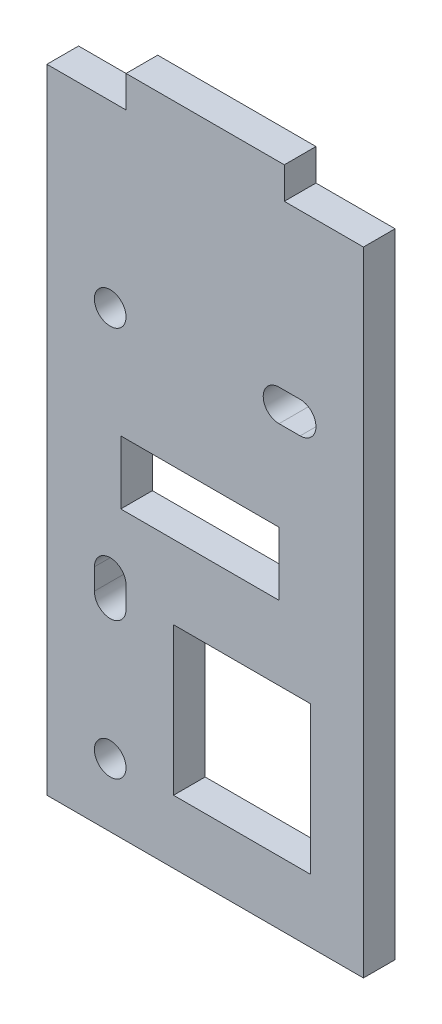
ISO-10303-21;
HEADER;
FILE_DESCRIPTION(('STEP AP214'),'2;1');
FILE_NAME('part.step','',(''),(''),'','','');
FILE_SCHEMA(('AUTOMOTIVE_DESIGN { 1 0 10303 214 1 1 1 1 }'));
ENDSEC;
DATA;
#1=APPLICATION_CONTEXT('core data for automotive mechanical design processes');
#2=APPLICATION_PROTOCOL_DEFINITION('international standard','automotive_design',2000,#1);
#3=PRODUCT_CONTEXT('',#1,'mechanical');
#4=PRODUCT('Part','Part','',(#3));
#5=PRODUCT_RELATED_PRODUCT_CATEGORY('part','',(#4));
#6=PRODUCT_DEFINITION_FORMATION('','',#4);
#7=PRODUCT_DEFINITION_CONTEXT('part definition',#1,'design');
#8=PRODUCT_DEFINITION('design','',#6,#7);
#9=PRODUCT_DEFINITION_SHAPE('','',#8);
#10=(LENGTH_UNIT() NAMED_UNIT(*) SI_UNIT(.MILLI.,.METRE.));
#11=(NAMED_UNIT(*) PLANE_ANGLE_UNIT() SI_UNIT($,.RADIAN.));
#12=(NAMED_UNIT(*) SI_UNIT($,.STERADIAN.) SOLID_ANGLE_UNIT());
#13=UNCERTAINTY_MEASURE_WITH_UNIT(LENGTH_MEASURE(1.E-05),#10,'distance_accuracy_value','');
#14=(GEOMETRIC_REPRESENTATION_CONTEXT(3) GLOBAL_UNCERTAINTY_ASSIGNED_CONTEXT((#13)) GLOBAL_UNIT_ASSIGNED_CONTEXT((#10,
#11,#12)) REPRESENTATION_CONTEXT('',''));
#15=CARTESIAN_POINT('',(0.,0.,0.));
#16=DIRECTION('',(0.,0.,1.));
#17=DIRECTION('',(1.,0.,0.));
#18=AXIS2_PLACEMENT_3D('',#15,#16,#17);
#19=CARTESIAN_POINT('',(0.,0.,3.));
#20=DIRECTION('',(0.,0.,-1.));
#21=DIRECTION('',(-1.,0.,0.));
#22=AXIS2_PLACEMENT_3D('',#19,#20,#21);
#23=PLANE('',#22);
#24=CARTESIAN_POINT('',(6.,21.,3.));
#25=DIRECTION('',(0.,0.,1.));
#26=DIRECTION('',(1.,0.,0.));
#27=AXIS2_PLACEMENT_3D('',#24,#25,#26);
#28=CIRCLE('',#27,1.5);
#29=CARTESIAN_POINT('',(7.5,21.,3.));
#30=VERTEX_POINT('',#29);
#31=CARTESIAN_POINT('',(4.5,21.,3.));
#32=VERTEX_POINT('',#31);
#33=EDGE_CURVE('E255',#30,#32,#28,.T.);
#34=ORIENTED_EDGE('',*,*,#33,.F.);
#35=DIRECTION('',(0.,1.,0.));
#36=VECTOR('',#35,1.);
#37=CARTESIAN_POINT('',(7.5,21.,3.));
#38=LINE('',#37,#36);
#39=CARTESIAN_POINT('',(7.5,19.,3.));
#40=VERTEX_POINT('',#39);
#41=EDGE_CURVE('E266',#40,#30,#38,.T.);
#42=ORIENTED_EDGE('',*,*,#41,.F.);
#43=CARTESIAN_POINT('',(6.,19.,3.));
#44=DIRECTION('',(0.,0.,1.));
#45=DIRECTION('',(1.,0.,0.));
#46=AXIS2_PLACEMENT_3D('',#43,#44,#45);
#47=CIRCLE('',#46,1.5);
#48=CARTESIAN_POINT('',(4.5,19.,3.));
#49=VERTEX_POINT('',#48);
#50=EDGE_CURVE('E262',#49,#40,#47,.T.);
#51=ORIENTED_EDGE('',*,*,#50,.F.);
#52=DIRECTION('',(0.,-1.,0.));
#53=VECTOR('',#52,1.);
#54=CARTESIAN_POINT('',(4.5,21.,3.));
#55=LINE('',#54,#53);
#56=EDGE_CURVE('E258',#32,#49,#55,.T.);
#57=ORIENTED_EDGE('',*,*,#56,.F.);
#58=EDGE_LOOP('',(#34,#42,#51,#57));
#59=FACE_BOUND('',#58,.T.);
#60=CARTESIAN_POINT('',(6.,43.,3.));
#61=DIRECTION('',(0.,0.,1.));
#62=DIRECTION('',(1.,0.,0.));
#63=AXIS2_PLACEMENT_3D('',#60,#61,#62);
#64=CIRCLE('',#63,1.5);
#65=CARTESIAN_POINT('',(7.5,43.,3.));
#66=VERTEX_POINT('',#65);
#67=EDGE_CURVE('E341',#66,#66,#64,.T.);
#68=ORIENTED_EDGE('',*,*,#67,.F.);
#69=EDGE_LOOP('',(#68));
#70=FACE_BOUND('',#69,.T.);
#71=CARTESIAN_POINT('',(6.,6.,3.));
#72=DIRECTION('',(0.,0.,1.));
#73=DIRECTION('',(1.,0.,0.));
#74=AXIS2_PLACEMENT_3D('',#71,#72,#73);
#75=CIRCLE('',#74,1.5);
#76=CARTESIAN_POINT('',(7.5,6.,3.));
#77=VERTEX_POINT('',#76);
#78=EDGE_CURVE('E349',#77,#77,#75,.T.);
#79=ORIENTED_EDGE('',*,*,#78,.F.);
#80=EDGE_LOOP('',(#79));
#81=FACE_BOUND('',#80,.T.);
#82=DIRECTION('',(0.,-1.,0.));
#83=VECTOR('',#82,1.);
#84=CARTESIAN_POINT('',(12.,20.,3.));
#85=LINE('',#84,#83);
#86=CARTESIAN_POINT('',(12.,20.,3.));
#87=VERTEX_POINT('',#86);
#88=CARTESIAN_POINT('',(12.,6.,3.));
#89=VERTEX_POINT('',#88);
#90=EDGE_CURVE('E357',#87,#89,#85,.T.);
#91=ORIENTED_EDGE('',*,*,#90,.F.);
#92=DIRECTION('',(-1.,0.,0.));
#93=VECTOR('',#92,1.);
#94=CARTESIAN_POINT('',(12.,20.,3.));
#95=LINE('',#94,#93);
#96=CARTESIAN_POINT('',(25.,20.,3.));
#97=VERTEX_POINT('',#96);
#98=EDGE_CURVE('E368',#97,#87,#95,.T.);
#99=ORIENTED_EDGE('',*,*,#98,.F.);
#100=DIRECTION('',(0.,1.,0.));
#101=VECTOR('',#100,1.);
#102=CARTESIAN_POINT('',(25.,20.,3.));
#103=LINE('',#102,#101);
#104=CARTESIAN_POINT('',(25.,6.,3.));
#105=VERTEX_POINT('',#104);
#106=EDGE_CURVE('E364',#105,#97,#103,.T.);
#107=ORIENTED_EDGE('',*,*,#106,.F.);
#108=DIRECTION('',(1.,0.,0.));
#109=VECTOR('',#108,1.);
#110=CARTESIAN_POINT('',(12.,6.,3.));
#111=LINE('',#110,#109);
#112=EDGE_CURVE('E360',#89,#105,#111,.T.);
#113=ORIENTED_EDGE('',*,*,#112,.F.);
#114=EDGE_LOOP('',(#91,#99,#107,#113));
#115=FACE_BOUND('',#114,.T.);
#116=DIRECTION('',(0.,-1.,0.));
#117=VECTOR('',#116,1.);
#118=CARTESIAN_POINT('',(0.,0.,3.));
#119=LINE('',#118,#117);
#120=CARTESIAN_POINT('',(0.,60.,3.));
#121=VERTEX_POINT('',#120);
#122=CARTESIAN_POINT('',(0.,0.,3.));
#123=VERTEX_POINT('',#122);
#124=EDGE_CURVE('E400',#121,#123,#119,.T.);
#125=ORIENTED_EDGE('',*,*,#124,.T.);
#126=DIRECTION('',(1.,0.,0.));
#127=VECTOR('',#126,1.);
#128=CARTESIAN_POINT('',(0.,0.,3.));
#129=LINE('',#128,#127);
#130=CARTESIAN_POINT('',(30.,0.,3.));
#131=VERTEX_POINT('',#130);
#132=EDGE_CURVE('E404',#123,#131,#129,.T.);
#133=ORIENTED_EDGE('',*,*,#132,.T.);
#134=DIRECTION('',(0.,1.,0.));
#135=VECTOR('',#134,1.);
#136=CARTESIAN_POINT('',(30.,0.,3.));
#137=LINE('',#136,#135);
#138=CARTESIAN_POINT('',(30.,60.,3.));
#139=VERTEX_POINT('',#138);
#140=EDGE_CURVE('E408',#131,#139,#137,.T.);
#141=ORIENTED_EDGE('',*,*,#140,.T.);
#142=DIRECTION('',(-1.,0.,0.));
#143=VECTOR('',#142,1.);
#144=CARTESIAN_POINT('',(22.5,60.,3.));
#145=LINE('',#144,#143);
#146=CARTESIAN_POINT('',(22.5,60.,3.));
#147=VERTEX_POINT('',#146);
#148=EDGE_CURVE('E411',#139,#147,#145,.T.);
#149=ORIENTED_EDGE('',*,*,#148,.T.);
#150=DIRECTION('',(0.,1.,0.));
#151=VECTOR('',#150,1.);
#152=CARTESIAN_POINT('',(22.5,60.,3.));
#153=LINE('',#152,#151);
#154=CARTESIAN_POINT('',(22.5,63.,3.));
#155=VERTEX_POINT('',#154);
#156=EDGE_CURVE('E414',#147,#155,#153,.T.);
#157=ORIENTED_EDGE('',*,*,#156,.T.);
#158=DIRECTION('',(-1.,0.,0.));
#159=VECTOR('',#158,1.);
#160=CARTESIAN_POINT('',(7.5,63.,3.));
#161=LINE('',#160,#159);
#162=CARTESIAN_POINT('',(7.5,63.,3.));
#163=VERTEX_POINT('',#162);
#164=EDGE_CURVE('E417',#155,#163,#161,.T.);
#165=ORIENTED_EDGE('',*,*,#164,.T.);
#166=DIRECTION('',(0.,-1.,0.));
#167=VECTOR('',#166,1.);
#168=CARTESIAN_POINT('',(7.5,60.,3.));
#169=LINE('',#168,#167);
#170=CARTESIAN_POINT('',(7.5,60.,3.));
#171=VERTEX_POINT('',#170);
#172=EDGE_CURVE('E420',#163,#171,#169,.T.);
#173=ORIENTED_EDGE('',*,*,#172,.T.);
#174=DIRECTION('',(-1.,0.,0.));
#175=VECTOR('',#174,1.);
#176=CARTESIAN_POINT('',(0.,60.,3.));
#177=LINE('',#176,#175);
#178=EDGE_CURVE('E423',#171,#121,#177,.T.);
#179=ORIENTED_EDGE('',*,*,#178,.T.);
#180=EDGE_LOOP('',(#125,#133,#141,#149,#157,#165,#173,#179));
#181=FACE_BOUND('',#180,.T.);
#182=DIRECTION('',(0.,-1.,0.));
#183=VECTOR('',#182,1.);
#184=CARTESIAN_POINT('',(7.,33.,3.));
#185=LINE('',#184,#183);
#186=CARTESIAN_POINT('',(7.,33.,3.));
#187=VERTEX_POINT('',#186);
#188=CARTESIAN_POINT('',(7.,27.,3.));
#189=VERTEX_POINT('',#188);
#190=EDGE_CURVE('E298',#187,#189,#185,.T.);
#191=ORIENTED_EDGE('',*,*,#190,.F.);
#192=DIRECTION('',(-1.,0.,0.));
#193=VECTOR('',#192,1.);
#194=CARTESIAN_POINT('',(7.,33.,3.));
#195=LINE('',#194,#193);
#196=CARTESIAN_POINT('',(22.,33.,3.));
#197=VERTEX_POINT('',#196);
#198=EDGE_CURVE('E309',#197,#187,#195,.T.);
#199=ORIENTED_EDGE('',*,*,#198,.F.);
#200=DIRECTION('',(0.,1.,0.));
#201=VECTOR('',#200,1.);
#202=CARTESIAN_POINT('',(22.,33.,3.));
#203=LINE('',#202,#201);
#204=CARTESIAN_POINT('',(22.,27.,3.));
#205=VERTEX_POINT('',#204);
#206=EDGE_CURVE('E305',#205,#197,#203,.T.);
#207=ORIENTED_EDGE('',*,*,#206,.F.);
#208=DIRECTION('',(1.,0.,0.));
#209=VECTOR('',#208,1.);
#210=CARTESIAN_POINT('',(7.,27.,3.));
#211=LINE('',#210,#209);
#212=EDGE_CURVE('E301',#189,#205,#211,.T.);
#213=ORIENTED_EDGE('',*,*,#212,.F.);
#214=EDGE_LOOP('',(#191,#199,#207,#213));
#215=FACE_BOUND('',#214,.T.);
#216=CARTESIAN_POINT('',(22.,43.,3.));
#217=DIRECTION('',(0.,0.,1.));
#218=DIRECTION('',(1.,0.,0.));
#219=AXIS2_PLACEMENT_3D('',#216,#217,#218);
#220=CIRCLE('',#219,1.5);
#221=CARTESIAN_POINT('',(22.,44.5,3.));
#222=VERTEX_POINT('',#221);
#223=CARTESIAN_POINT('',(22.,41.5,3.));
#224=VERTEX_POINT('',#223);
#225=EDGE_CURVE('E207',#222,#224,#220,.T.);
#226=ORIENTED_EDGE('',*,*,#225,.F.);
#227=DIRECTION('',(-1.,0.,0.));
#228=VECTOR('',#227,1.);
#229=CARTESIAN_POINT('',(22.,44.5,3.));
#230=LINE('',#229,#228);
#231=CARTESIAN_POINT('',(24.,44.5,3.));
#232=VERTEX_POINT('',#231);
#233=EDGE_CURVE('E233',#232,#222,#230,.T.);
#234=ORIENTED_EDGE('',*,*,#233,.F.);
#235=CARTESIAN_POINT('',(24.,43.,3.));
#236=DIRECTION('',(0.,0.,1.));
#237=DIRECTION('',(1.,0.,0.));
#238=AXIS2_PLACEMENT_3D('',#235,#236,#237);
#239=CIRCLE('',#238,1.5);
#240=CARTESIAN_POINT('',(24.,41.5,3.));
#241=VERTEX_POINT('',#240);
#242=EDGE_CURVE('E229',#241,#232,#239,.T.);
#243=ORIENTED_EDGE('',*,*,#242,.F.);
#244=DIRECTION('',(1.,0.,0.));
#245=VECTOR('',#244,1.);
#246=CARTESIAN_POINT('',(22.,41.5,3.));
#247=LINE('',#246,#245);
#248=EDGE_CURVE('E216',#224,#241,#247,.T.);
#249=ORIENTED_EDGE('',*,*,#248,.F.);
#250=EDGE_LOOP('',(#226,#234,#243,#249));
#251=FACE_BOUND('',#250,.T.);
#252=ADVANCED_FACE('F45',(#59,#70,#81,#115,#181,#215,#251),#23,.F.);
#253=CARTESIAN_POINT('',(0.,0.,0.));
#254=DIRECTION('',(0.,0.,-1.));
#255=DIRECTION('',(-1.,0.,0.));
#256=AXIS2_PLACEMENT_3D('',#253,#254,#255);
#257=PLANE('',#256);
#258=CARTESIAN_POINT('',(6.,6.,0.));
#259=DIRECTION('',(0.,0.,1.));
#260=DIRECTION('',(1.,0.,0.));
#261=AXIS2_PLACEMENT_3D('',#258,#259,#260);
#262=CIRCLE('',#261,1.5);
#263=CARTESIAN_POINT('',(7.5,6.,0.));
#264=VERTEX_POINT('',#263);
#265=EDGE_CURVE('E345',#264,#264,#262,.T.);
#266=ORIENTED_EDGE('',*,*,#265,.T.);
#267=EDGE_LOOP('',(#266));
#268=FACE_BOUND('',#267,.T.);
#269=DIRECTION('',(0.,-1.,0.));
#270=VECTOR('',#269,1.);
#271=CARTESIAN_POINT('',(0.,0.,0.));
#272=LINE('',#271,#270);
#273=CARTESIAN_POINT('',(0.,60.,0.));
#274=VERTEX_POINT('',#273);
#275=CARTESIAN_POINT('',(0.,0.,0.));
#276=VERTEX_POINT('',#275);
#277=EDGE_CURVE('E399',#274,#276,#272,.T.);
#278=ORIENTED_EDGE('',*,*,#277,.F.);
#279=DIRECTION('',(-1.,0.,0.));
#280=VECTOR('',#279,1.);
#281=CARTESIAN_POINT('',(0.,60.,0.));
#282=LINE('',#281,#280);
#283=CARTESIAN_POINT('',(7.5,60.,0.));
#284=VERTEX_POINT('',#283);
#285=EDGE_CURVE('E405',#284,#274,#282,.T.);
#286=ORIENTED_EDGE('',*,*,#285,.F.);
#287=DIRECTION('',(0.,-1.,0.));
#288=VECTOR('',#287,1.);
#289=CARTESIAN_POINT('',(7.5,60.,0.));
#290=LINE('',#289,#288);
#291=CARTESIAN_POINT('',(7.5,63.,0.));
#292=VERTEX_POINT('',#291);
#293=EDGE_CURVE('E445',#292,#284,#290,.T.);
#294=ORIENTED_EDGE('',*,*,#293,.F.);
#295=DIRECTION('',(-1.,0.,0.));
#296=VECTOR('',#295,1.);
#297=CARTESIAN_POINT('',(7.5,63.,0.));
#298=LINE('',#297,#296);
#299=CARTESIAN_POINT('',(22.5,63.,0.));
#300=VERTEX_POINT('',#299);
#301=EDGE_CURVE('E442',#300,#292,#298,.T.);
#302=ORIENTED_EDGE('',*,*,#301,.F.);
#303=DIRECTION('',(0.,1.,0.));
#304=VECTOR('',#303,1.);
#305=CARTESIAN_POINT('',(22.5,60.,0.));
#306=LINE('',#305,#304);
#307=CARTESIAN_POINT('',(22.5,60.,0.));
#308=VERTEX_POINT('',#307);
#309=EDGE_CURVE('E439',#308,#300,#306,.T.);
#310=ORIENTED_EDGE('',*,*,#309,.F.);
#311=DIRECTION('',(-1.,0.,0.));
#312=VECTOR('',#311,1.);
#313=CARTESIAN_POINT('',(22.5,60.,0.));
#314=LINE('',#313,#312);
#315=CARTESIAN_POINT('',(30.,60.,0.));
#316=VERTEX_POINT('',#315);
#317=EDGE_CURVE('E436',#316,#308,#314,.T.);
#318=ORIENTED_EDGE('',*,*,#317,.F.);
#319=DIRECTION('',(0.,1.,0.));
#320=VECTOR('',#319,1.);
#321=CARTESIAN_POINT('',(30.,0.,0.));
#322=LINE('',#321,#320);
#323=CARTESIAN_POINT('',(30.,0.,0.));
#324=VERTEX_POINT('',#323);
#325=EDGE_CURVE('E433',#324,#316,#322,.T.);
#326=ORIENTED_EDGE('',*,*,#325,.F.);
#327=DIRECTION('',(1.,0.,0.));
#328=VECTOR('',#327,1.);
#329=CARTESIAN_POINT('',(0.,0.,0.));
#330=LINE('',#329,#328);
#331=EDGE_CURVE('E430',#276,#324,#330,.T.);
#332=ORIENTED_EDGE('',*,*,#331,.F.);
#333=EDGE_LOOP('',(#278,#286,#294,#302,#310,#318,#326,#332));
#334=FACE_BOUND('',#333,.T.);
#335=DIRECTION('',(-1.,0.,0.));
#336=VECTOR('',#335,1.);
#337=CARTESIAN_POINT('',(12.,20.,0.));
#338=LINE('',#337,#336);
#339=CARTESIAN_POINT('',(25.,20.,0.));
#340=VERTEX_POINT('',#339);
#341=CARTESIAN_POINT('',(12.,20.,0.));
#342=VERTEX_POINT('',#341);
#343=EDGE_CURVE('E361',#340,#342,#338,.T.);
#344=ORIENTED_EDGE('',*,*,#343,.T.);
#345=DIRECTION('',(0.,-1.,0.));
#346=VECTOR('',#345,1.);
#347=CARTESIAN_POINT('',(12.,20.,0.));
#348=LINE('',#347,#346);
#349=CARTESIAN_POINT('',(12.,6.,0.));
#350=VERTEX_POINT('',#349);
#351=EDGE_CURVE('E353',#342,#350,#348,.T.);
#352=ORIENTED_EDGE('',*,*,#351,.T.);
#353=DIRECTION('',(1.,0.,0.));
#354=VECTOR('',#353,1.);
#355=CARTESIAN_POINT('',(12.,6.,0.));
#356=LINE('',#355,#354);
#357=CARTESIAN_POINT('',(25.,6.,0.));
#358=VERTEX_POINT('',#357);
#359=EDGE_CURVE('E375',#350,#358,#356,.T.);
#360=ORIENTED_EDGE('',*,*,#359,.T.);
#361=DIRECTION('',(0.,1.,0.));
#362=VECTOR('',#361,1.);
#363=CARTESIAN_POINT('',(25.,20.,0.));
#364=LINE('',#363,#362);
#365=EDGE_CURVE('E379',#358,#340,#364,.T.);
#366=ORIENTED_EDGE('',*,*,#365,.T.);
#367=EDGE_LOOP('',(#344,#352,#360,#366));
#368=FACE_BOUND('',#367,.T.);
#369=CARTESIAN_POINT('',(6.,43.,0.));
#370=DIRECTION('',(0.,0.,1.));
#371=DIRECTION('',(1.,0.,0.));
#372=AXIS2_PLACEMENT_3D('',#369,#370,#371);
#373=CIRCLE('',#372,1.5);
#374=CARTESIAN_POINT('',(7.5,43.,0.));
#375=VERTEX_POINT('',#374);
#376=EDGE_CURVE('E340',#375,#375,#373,.T.);
#377=ORIENTED_EDGE('',*,*,#376,.T.);
#378=EDGE_LOOP('',(#377));
#379=FACE_BOUND('',#378,.T.);
#380=DIRECTION('',(-1.,0.,0.));
#381=VECTOR('',#380,1.);
#382=CARTESIAN_POINT('',(7.,33.,0.));
#383=LINE('',#382,#381);
#384=CARTESIAN_POINT('',(22.,33.,0.));
#385=VERTEX_POINT('',#384);
#386=CARTESIAN_POINT('',(7.,33.,0.));
#387=VERTEX_POINT('',#386);
#388=EDGE_CURVE('E302',#385,#387,#383,.T.);
#389=ORIENTED_EDGE('',*,*,#388,.T.);
#390=DIRECTION('',(0.,-1.,0.));
#391=VECTOR('',#390,1.);
#392=CARTESIAN_POINT('',(7.,33.,0.));
#393=LINE('',#392,#391);
#394=CARTESIAN_POINT('',(7.,27.,0.));
#395=VERTEX_POINT('',#394);
#396=EDGE_CURVE('E297',#387,#395,#393,.T.);
#397=ORIENTED_EDGE('',*,*,#396,.T.);
#398=DIRECTION('',(1.,0.,0.));
#399=VECTOR('',#398,1.);
#400=CARTESIAN_POINT('',(7.,27.,0.));
#401=LINE('',#400,#399);
#402=CARTESIAN_POINT('',(22.,27.,0.));
#403=VERTEX_POINT('',#402);
#404=EDGE_CURVE('E316',#395,#403,#401,.T.);
#405=ORIENTED_EDGE('',*,*,#404,.T.);
#406=DIRECTION('',(0.,1.,0.));
#407=VECTOR('',#406,1.);
#408=CARTESIAN_POINT('',(22.,33.,0.));
#409=LINE('',#408,#407);
#410=EDGE_CURVE('E320',#403,#385,#409,.T.);
#411=ORIENTED_EDGE('',*,*,#410,.T.);
#412=EDGE_LOOP('',(#389,#397,#405,#411));
#413=FACE_BOUND('',#412,.T.);
#414=DIRECTION('',(0.,1.,0.));
#415=VECTOR('',#414,1.);
#416=CARTESIAN_POINT('',(7.5,21.,0.));
#417=LINE('',#416,#415);
#418=CARTESIAN_POINT('',(7.5,19.,0.));
#419=VERTEX_POINT('',#418);
#420=CARTESIAN_POINT('',(7.5,21.,0.));
#421=VERTEX_POINT('',#420);
#422=EDGE_CURVE('E259',#419,#421,#417,.T.);
#423=ORIENTED_EDGE('',*,*,#422,.T.);
#424=CARTESIAN_POINT('',(6.,21.,0.));
#425=DIRECTION('',(0.,0.,1.));
#426=DIRECTION('',(1.,0.,0.));
#427=AXIS2_PLACEMENT_3D('',#424,#425,#426);
#428=CIRCLE('',#427,1.5);
#429=CARTESIAN_POINT('',(4.5,21.,0.));
#430=VERTEX_POINT('',#429);
#431=EDGE_CURVE('E225',#421,#430,#428,.T.);
#432=ORIENTED_EDGE('',*,*,#431,.T.);
#433=DIRECTION('',(0.,-1.,0.));
#434=VECTOR('',#433,1.);
#435=CARTESIAN_POINT('',(4.5,21.,0.));
#436=LINE('',#435,#434);
#437=CARTESIAN_POINT('',(4.5,19.,0.));
#438=VERTEX_POINT('',#437);
#439=EDGE_CURVE('E273',#430,#438,#436,.T.);
#440=ORIENTED_EDGE('',*,*,#439,.T.);
#441=CARTESIAN_POINT('',(6.,19.,0.));
#442=DIRECTION('',(0.,0.,1.));
#443=DIRECTION('',(1.,0.,0.));
#444=AXIS2_PLACEMENT_3D('',#441,#442,#443);
#445=CIRCLE('',#444,1.5);
#446=EDGE_CURVE('E277',#438,#419,#445,.T.);
#447=ORIENTED_EDGE('',*,*,#446,.T.);
#448=EDGE_LOOP('',(#423,#432,#440,#447));
#449=FACE_BOUND('',#448,.T.);
#450=DIRECTION('',(-1.,0.,0.));
#451=VECTOR('',#450,1.);
#452=CARTESIAN_POINT('',(22.,44.5,0.));
#453=LINE('',#452,#451);
#454=CARTESIAN_POINT('',(24.,44.5,0.));
#455=VERTEX_POINT('',#454);
#456=CARTESIAN_POINT('',(22.,44.5,0.));
#457=VERTEX_POINT('',#456);
#458=EDGE_CURVE('E217',#455,#457,#453,.T.);
#459=ORIENTED_EDGE('',*,*,#458,.T.);
#460=CARTESIAN_POINT('',(22.,43.,0.));
#461=DIRECTION('',(0.,0.,1.));
#462=DIRECTION('',(1.,0.,0.));
#463=AXIS2_PLACEMENT_3D('',#460,#461,#462);
#464=CIRCLE('',#463,1.5);
#465=CARTESIAN_POINT('',(22.,41.5,0.));
#466=VERTEX_POINT('',#465);
#467=EDGE_CURVE('E69',#457,#466,#464,.T.);
#468=ORIENTED_EDGE('',*,*,#467,.T.);
#469=DIRECTION('',(1.,0.,0.));
#470=VECTOR('',#469,1.);
#471=CARTESIAN_POINT('',(22.,41.5,0.));
#472=LINE('',#471,#470);
#473=CARTESIAN_POINT('',(24.,41.5,0.));
#474=VERTEX_POINT('',#473);
#475=EDGE_CURVE('E223',#466,#474,#472,.T.);
#476=ORIENTED_EDGE('',*,*,#475,.T.);
#477=CARTESIAN_POINT('',(24.,43.,0.));
#478=DIRECTION('',(0.,0.,1.));
#479=DIRECTION('',(1.,0.,0.));
#480=AXIS2_PLACEMENT_3D('',#477,#478,#479);
#481=CIRCLE('',#480,1.5);
#482=EDGE_CURVE('E242',#474,#455,#481,.T.);
#483=ORIENTED_EDGE('',*,*,#482,.T.);
#484=EDGE_LOOP('',(#459,#468,#476,#483));
#485=FACE_BOUND('',#484,.T.);
#486=ADVANCED_FACE('F484',(#268,#334,#368,#379,#413,#449,#485),#257,.T.);
#487=CARTESIAN_POINT('',(0.,0.,3.));
#488=DIRECTION('',(1.,0.,0.));
#489=DIRECTION('',(0.,0.,-1.));
#490=AXIS2_PLACEMENT_3D('',#487,#488,#489);
#491=PLANE('',#490);
#492=ORIENTED_EDGE('',*,*,#277,.T.);
#493=DIRECTION('',(0.,0.,-1.));
#494=VECTOR('',#493,1.);
#495=CARTESIAN_POINT('',(0.,0.,3.));
#496=LINE('',#495,#494);
#497=EDGE_CURVE('E11',#123,#276,#496,.T.);
#498=ORIENTED_EDGE('',*,*,#497,.F.);
#499=ORIENTED_EDGE('',*,*,#124,.F.);
#500=DIRECTION('',(0.,0.,-1.));
#501=VECTOR('',#500,1.);
#502=CARTESIAN_POINT('',(0.,60.,3.));
#503=LINE('',#502,#501);
#504=EDGE_CURVE('E426',#121,#274,#503,.T.);
#505=ORIENTED_EDGE('',*,*,#504,.T.);
#506=EDGE_LOOP('',(#492,#498,#499,#505));
#507=FACE_BOUND('',#506,.T.);
#508=ADVANCED_FACE('F47',(#507),#491,.F.);
#509=CARTESIAN_POINT('',(0.,0.,3.));
#510=DIRECTION('',(0.,1.,0.));
#511=DIRECTION('',(0.,0.,1.));
#512=AXIS2_PLACEMENT_3D('',#509,#510,#511);
#513=PLANE('',#512);
#514=ORIENTED_EDGE('',*,*,#331,.T.);
#515=DIRECTION('',(0.,0.,-1.));
#516=VECTOR('',#515,1.);
#517=CARTESIAN_POINT('',(30.,0.,3.));
#518=LINE('',#517,#516);
#519=EDGE_CURVE('E54',#131,#324,#518,.T.);
#520=ORIENTED_EDGE('',*,*,#519,.F.);
#521=ORIENTED_EDGE('',*,*,#132,.F.);
#522=ORIENTED_EDGE('',*,*,#497,.T.);
#523=EDGE_LOOP('',(#514,#520,#521,#522));
#524=FACE_BOUND('',#523,.T.);
#525=ADVANCED_FACE('F502',(#524),#513,.F.);
#526=CARTESIAN_POINT('',(30.,0.,3.));
#527=DIRECTION('',(-1.,0.,0.));
#528=DIRECTION('',(0.,0.,1.));
#529=AXIS2_PLACEMENT_3D('',#526,#527,#528);
#530=PLANE('',#529);
#531=ORIENTED_EDGE('',*,*,#325,.T.);
#532=DIRECTION('',(0.,0.,-1.));
#533=VECTOR('',#532,1.);
#534=CARTESIAN_POINT('',(30.,60.,3.));
#535=LINE('',#534,#533);
#536=EDGE_CURVE('E469',#139,#316,#535,.T.);
#537=ORIENTED_EDGE('',*,*,#536,.F.);
#538=ORIENTED_EDGE('',*,*,#140,.F.);
#539=ORIENTED_EDGE('',*,*,#519,.T.);
#540=EDGE_LOOP('',(#531,#537,#538,#539));
#541=FACE_BOUND('',#540,.T.);
#542=ADVANCED_FACE('F478',(#541),#530,.F.);
#543=CARTESIAN_POINT('',(22.5,60.,3.));
#544=DIRECTION('',(0.,-1.,0.));
#545=DIRECTION('',(0.,0.,-1.));
#546=AXIS2_PLACEMENT_3D('',#543,#544,#545);
#547=PLANE('',#546);
#548=ORIENTED_EDGE('',*,*,#317,.T.);
#549=DIRECTION('',(0.,0.,-1.));
#550=VECTOR('',#549,1.);
#551=CARTESIAN_POINT('',(22.5,60.,3.));
#552=LINE('',#551,#550);
#553=EDGE_CURVE('E465',#147,#308,#552,.T.);
#554=ORIENTED_EDGE('',*,*,#553,.F.);
#555=ORIENTED_EDGE('',*,*,#148,.F.);
#556=ORIENTED_EDGE('',*,*,#536,.T.);
#557=EDGE_LOOP('',(#548,#554,#555,#556));
#558=FACE_BOUND('',#557,.T.);
#559=ADVANCED_FACE('F490',(#558),#547,.F.);
#560=CARTESIAN_POINT('',(22.5,60.,3.));
#561=DIRECTION('',(-1.,0.,0.));
#562=DIRECTION('',(0.,0.,1.));
#563=AXIS2_PLACEMENT_3D('',#560,#561,#562);
#564=PLANE('',#563);
#565=ORIENTED_EDGE('',*,*,#309,.T.);
#566=DIRECTION('',(0.,0.,-1.));
#567=VECTOR('',#566,1.);
#568=CARTESIAN_POINT('',(22.5,63.,3.));
#569=LINE('',#568,#567);
#570=EDGE_CURVE('E461',#155,#300,#569,.T.);
#571=ORIENTED_EDGE('',*,*,#570,.F.);
#572=ORIENTED_EDGE('',*,*,#156,.F.);
#573=ORIENTED_EDGE('',*,*,#553,.T.);
#574=EDGE_LOOP('',(#565,#571,#572,#573));
#575=FACE_BOUND('',#574,.T.);
#576=ADVANCED_FACE('F494',(#575),#564,.F.);
#577=CARTESIAN_POINT('',(7.5,63.,3.));
#578=DIRECTION('',(0.,-1.,0.));
#579=DIRECTION('',(0.,0.,-1.));
#580=AXIS2_PLACEMENT_3D('',#577,#578,#579);
#581=PLANE('',#580);
#582=ORIENTED_EDGE('',*,*,#301,.T.);
#583=DIRECTION('',(0.,0.,-1.));
#584=VECTOR('',#583,1.);
#585=CARTESIAN_POINT('',(7.5,63.,3.));
#586=LINE('',#585,#584);
#587=EDGE_CURVE('E457',#163,#292,#586,.T.);
#588=ORIENTED_EDGE('',*,*,#587,.F.);
#589=ORIENTED_EDGE('',*,*,#164,.F.);
#590=ORIENTED_EDGE('',*,*,#570,.T.);
#591=EDGE_LOOP('',(#582,#588,#589,#590));
#592=FACE_BOUND('',#591,.T.);
#593=ADVANCED_FACE('F515',(#592),#581,.F.);
#594=CARTESIAN_POINT('',(7.5,60.,3.));
#595=DIRECTION('',(1.,0.,0.));
#596=DIRECTION('',(0.,0.,-1.));
#597=AXIS2_PLACEMENT_3D('',#594,#595,#596);
#598=PLANE('',#597);
#599=ORIENTED_EDGE('',*,*,#293,.T.);
#600=DIRECTION('',(0.,0.,-1.));
#601=VECTOR('',#600,1.);
#602=CARTESIAN_POINT('',(7.5,60.,3.));
#603=LINE('',#602,#601);
#604=EDGE_CURVE('E453',#171,#284,#603,.T.);
#605=ORIENTED_EDGE('',*,*,#604,.F.);
#606=ORIENTED_EDGE('',*,*,#172,.F.);
#607=ORIENTED_EDGE('',*,*,#587,.T.);
#608=EDGE_LOOP('',(#599,#605,#606,#607));
#609=FACE_BOUND('',#608,.T.);
#610=ADVANCED_FACE('F513',(#609),#598,.F.);
#611=CARTESIAN_POINT('',(0.,60.,3.));
#612=DIRECTION('',(0.,-1.,0.));
#613=DIRECTION('',(0.,0.,-1.));
#614=AXIS2_PLACEMENT_3D('',#611,#612,#613);
#615=PLANE('',#614);
#616=ORIENTED_EDGE('',*,*,#285,.T.);
#617=ORIENTED_EDGE('',*,*,#504,.F.);
#618=ORIENTED_EDGE('',*,*,#178,.F.);
#619=ORIENTED_EDGE('',*,*,#604,.T.);
#620=EDGE_LOOP('',(#616,#617,#618,#619));
#621=FACE_BOUND('',#620,.T.);
#622=ADVANCED_FACE('F508',(#621),#615,.F.);
#623=CARTESIAN_POINT('',(12.,20.,3.));
#624=DIRECTION('',(1.,0.,0.));
#625=DIRECTION('',(0.,1.,0.));
#626=AXIS2_PLACEMENT_3D('',#623,#624,#625);
#627=PLANE('',#626);
#628=ORIENTED_EDGE('',*,*,#351,.F.);
#629=DIRECTION('',(0.,0.,-1.));
#630=VECTOR('',#629,1.);
#631=CARTESIAN_POINT('',(12.,20.,3.));
#632=LINE('',#631,#630);
#633=EDGE_CURVE('E371',#87,#342,#632,.T.);
#634=ORIENTED_EDGE('',*,*,#633,.F.);
#635=ORIENTED_EDGE('',*,*,#90,.T.);
#636=DIRECTION('',(0.,0.,-1.));
#637=VECTOR('',#636,1.);
#638=CARTESIAN_POINT('',(12.,6.,3.));
#639=LINE('',#638,#637);
#640=EDGE_CURVE('E395',#89,#350,#639,.T.);
#641=ORIENTED_EDGE('',*,*,#640,.T.);
#642=EDGE_LOOP('',(#628,#634,#635,#641));
#643=FACE_BOUND('',#642,.T.);
#644=ADVANCED_FACE('F535',(#643),#627,.T.);
#645=CARTESIAN_POINT('',(12.,6.,3.));
#646=DIRECTION('',(0.,1.,0.));
#647=DIRECTION('',(-1.,0.,0.));
#648=AXIS2_PLACEMENT_3D('',#645,#646,#647);
#649=PLANE('',#648);
#650=ORIENTED_EDGE('',*,*,#359,.F.);
#651=ORIENTED_EDGE('',*,*,#640,.F.);
#652=ORIENTED_EDGE('',*,*,#112,.T.);
#653=DIRECTION('',(0.,0.,-1.));
#654=VECTOR('',#653,1.);
#655=CARTESIAN_POINT('',(25.,6.,3.));
#656=LINE('',#655,#654);
#657=EDGE_CURVE('E392',#105,#358,#656,.T.);
#658=ORIENTED_EDGE('',*,*,#657,.T.);
#659=EDGE_LOOP('',(#650,#651,#652,#658));
#660=FACE_BOUND('',#659,.T.);
#661=ADVANCED_FACE('F542',(#660),#649,.T.);
#662=CARTESIAN_POINT('',(25.,20.,3.));
#663=DIRECTION('',(-1.,0.,0.));
#664=DIRECTION('',(0.,-1.,0.));
#665=AXIS2_PLACEMENT_3D('',#662,#663,#664);
#666=PLANE('',#665);
#667=ORIENTED_EDGE('',*,*,#365,.F.);
#668=ORIENTED_EDGE('',*,*,#657,.F.);
#669=ORIENTED_EDGE('',*,*,#106,.T.);
#670=DIRECTION('',(0.,0.,-1.));
#671=VECTOR('',#670,1.);
#672=CARTESIAN_POINT('',(25.,20.,3.));
#673=LINE('',#672,#671);
#674=EDGE_CURVE('E389',#97,#340,#673,.T.);
#675=ORIENTED_EDGE('',*,*,#674,.T.);
#676=EDGE_LOOP('',(#667,#668,#669,#675));
#677=FACE_BOUND('',#676,.T.);
#678=ADVANCED_FACE('F547',(#677),#666,.T.);
#679=CARTESIAN_POINT('',(12.,20.,3.));
#680=DIRECTION('',(0.,-1.,0.));
#681=DIRECTION('',(0.,0.,-1.));
#682=AXIS2_PLACEMENT_3D('',#679,#680,#681);
#683=PLANE('',#682);
#684=ORIENTED_EDGE('',*,*,#343,.F.);
#685=ORIENTED_EDGE('',*,*,#674,.F.);
#686=ORIENTED_EDGE('',*,*,#98,.T.);
#687=ORIENTED_EDGE('',*,*,#633,.T.);
#688=EDGE_LOOP('',(#684,#685,#686,#687));
#689=FACE_BOUND('',#688,.T.);
#690=ADVANCED_FACE('F554',(#689),#683,.T.);
#691=CARTESIAN_POINT('',(6.,6.,3.));
#692=DIRECTION('',(0.,0.,-1.));
#693=DIRECTION('',(-1.,0.,0.));
#694=AXIS2_PLACEMENT_3D('',#691,#692,#693);
#695=CYLINDRICAL_SURFACE('',#694,1.5);
#696=ORIENTED_EDGE('',*,*,#78,.T.);
#697=EDGE_LOOP('',(#696));
#698=FACE_BOUND('',#697,.T.);
#699=ORIENTED_EDGE('',*,*,#265,.F.);
#700=EDGE_LOOP('',(#699));
#701=FACE_BOUND('',#700,.T.);
#702=ADVANCED_FACE('F568',(#698,#701),#695,.F.);
#703=CARTESIAN_POINT('',(6.,43.,3.));
#704=DIRECTION('',(0.,0.,-1.));
#705=DIRECTION('',(-1.,0.,0.));
#706=AXIS2_PLACEMENT_3D('',#703,#704,#705);
#707=CYLINDRICAL_SURFACE('',#706,1.5);
#708=ORIENTED_EDGE('',*,*,#67,.T.);
#709=EDGE_LOOP('',(#708));
#710=FACE_BOUND('',#709,.T.);
#711=ORIENTED_EDGE('',*,*,#376,.F.);
#712=EDGE_LOOP('',(#711));
#713=FACE_BOUND('',#712,.T.);
#714=ADVANCED_FACE('F573',(#710,#713),#707,.F.);
#715=CARTESIAN_POINT('',(7.,33.,3.));
#716=DIRECTION('',(1.,0.,0.));
#717=DIRECTION('',(0.,1.,0.));
#718=AXIS2_PLACEMENT_3D('',#715,#716,#717);
#719=PLANE('',#718);
#720=ORIENTED_EDGE('',*,*,#396,.F.);
#721=DIRECTION('',(0.,0.,-1.));
#722=VECTOR('',#721,1.);
#723=CARTESIAN_POINT('',(7.,33.,3.));
#724=LINE('',#723,#722);
#725=EDGE_CURVE('E312',#187,#387,#724,.T.);
#726=ORIENTED_EDGE('',*,*,#725,.F.);
#727=ORIENTED_EDGE('',*,*,#190,.T.);
#728=DIRECTION('',(0.,0.,-1.));
#729=VECTOR('',#728,1.);
#730=CARTESIAN_POINT('',(7.,27.,3.));
#731=LINE('',#730,#729);
#732=EDGE_CURVE('E336',#189,#395,#731,.T.);
#733=ORIENTED_EDGE('',*,*,#732,.T.);
#734=EDGE_LOOP('',(#720,#726,#727,#733));
#735=FACE_BOUND('',#734,.T.);
#736=ADVANCED_FACE('F577',(#735),#719,.T.);
#737=CARTESIAN_POINT('',(7.,27.,3.));
#738=DIRECTION('',(0.,1.,0.));
#739=DIRECTION('',(0.,0.,1.));
#740=AXIS2_PLACEMENT_3D('',#737,#738,#739);
#741=PLANE('',#740);
#742=ORIENTED_EDGE('',*,*,#404,.F.);
#743=ORIENTED_EDGE('',*,*,#732,.F.);
#744=ORIENTED_EDGE('',*,*,#212,.T.);
#745=DIRECTION('',(0.,0.,-1.));
#746=VECTOR('',#745,1.);
#747=CARTESIAN_POINT('',(22.,27.,3.));
#748=LINE('',#747,#746);
#749=EDGE_CURVE('E333',#205,#403,#748,.T.);
#750=ORIENTED_EDGE('',*,*,#749,.T.);
#751=EDGE_LOOP('',(#742,#743,#744,#750));
#752=FACE_BOUND('',#751,.T.);
#753=ADVANCED_FACE('F581',(#752),#741,.T.);
#754=CARTESIAN_POINT('',(22.,33.,3.));
#755=DIRECTION('',(-1.,0.,0.));
#756=DIRECTION('',(0.,0.,1.));
#757=AXIS2_PLACEMENT_3D('',#754,#755,#756);
#758=PLANE('',#757);
#759=ORIENTED_EDGE('',*,*,#410,.F.);
#760=ORIENTED_EDGE('',*,*,#749,.F.);
#761=ORIENTED_EDGE('',*,*,#206,.T.);
#762=DIRECTION('',(0.,0.,-1.));
#763=VECTOR('',#762,1.);
#764=CARTESIAN_POINT('',(22.,33.,3.));
#765=LINE('',#764,#763);
#766=EDGE_CURVE('E330',#197,#385,#765,.T.);
#767=ORIENTED_EDGE('',*,*,#766,.T.);
#768=EDGE_LOOP('',(#759,#760,#761,#767));
#769=FACE_BOUND('',#768,.T.);
#770=ADVANCED_FACE('F585',(#769),#758,.T.);
#771=CARTESIAN_POINT('',(7.,33.,3.));
#772=DIRECTION('',(0.,-1.,0.));
#773=DIRECTION('',(0.,0.,-1.));
#774=AXIS2_PLACEMENT_3D('',#771,#772,#773);
#775=PLANE('',#774);
#776=ORIENTED_EDGE('',*,*,#388,.F.);
#777=ORIENTED_EDGE('',*,*,#766,.F.);
#778=ORIENTED_EDGE('',*,*,#198,.T.);
#779=ORIENTED_EDGE('',*,*,#725,.T.);
#780=EDGE_LOOP('',(#776,#777,#778,#779));
#781=FACE_BOUND('',#780,.T.);
#782=ADVANCED_FACE('F589',(#781),#775,.T.);
#783=CARTESIAN_POINT('',(6.,21.,3.));
#784=DIRECTION('',(0.,0.,-1.));
#785=DIRECTION('',(-1.,0.,0.));
#786=AXIS2_PLACEMENT_3D('',#783,#784,#785);
#787=CYLINDRICAL_SURFACE('',#786,1.5);
#788=ORIENTED_EDGE('',*,*,#431,.F.);
#789=DIRECTION('',(0.,0.,-1.));
#790=VECTOR('',#789,1.);
#791=CARTESIAN_POINT('',(7.5,21.,3.));
#792=LINE('',#791,#790);
#793=EDGE_CURVE('E269',#30,#421,#792,.T.);
#794=ORIENTED_EDGE('',*,*,#793,.F.);
#795=ORIENTED_EDGE('',*,*,#33,.T.);
#796=DIRECTION('',(0.,0.,-1.));
#797=VECTOR('',#796,1.);
#798=CARTESIAN_POINT('',(4.5,21.,3.));
#799=LINE('',#798,#797);
#800=EDGE_CURVE('E293',#32,#430,#799,.T.);
#801=ORIENTED_EDGE('',*,*,#800,.T.);
#802=EDGE_LOOP('',(#788,#794,#795,#801));
#803=FACE_BOUND('',#802,.T.);
#804=ADVANCED_FACE('F593',(#803),#787,.F.);
#805=CARTESIAN_POINT('',(4.5,21.,3.));
#806=DIRECTION('',(1.,0.,0.));
#807=DIRECTION('',(0.,0.,-1.));
#808=AXIS2_PLACEMENT_3D('',#805,#806,#807);
#809=PLANE('',#808);
#810=ORIENTED_EDGE('',*,*,#439,.F.);
#811=ORIENTED_EDGE('',*,*,#800,.F.);
#812=ORIENTED_EDGE('',*,*,#56,.T.);
#813=DIRECTION('',(0.,0.,-1.));
#814=VECTOR('',#813,1.);
#815=CARTESIAN_POINT('',(4.5,19.,3.));
#816=LINE('',#815,#814);
#817=EDGE_CURVE('E290',#49,#438,#816,.T.);
#818=ORIENTED_EDGE('',*,*,#817,.T.);
#819=EDGE_LOOP('',(#810,#811,#812,#818));
#820=FACE_BOUND('',#819,.T.);
#821=ADVANCED_FACE('F597',(#820),#809,.T.);
#822=CARTESIAN_POINT('',(6.,19.,3.));
#823=DIRECTION('',(0.,0.,-1.));
#824=DIRECTION('',(-1.,0.,0.));
#825=AXIS2_PLACEMENT_3D('',#822,#823,#824);
#826=CYLINDRICAL_SURFACE('',#825,1.5);
#827=ORIENTED_EDGE('',*,*,#446,.F.);
#828=ORIENTED_EDGE('',*,*,#817,.F.);
#829=ORIENTED_EDGE('',*,*,#50,.T.);
#830=DIRECTION('',(0.,0.,-1.));
#831=VECTOR('',#830,1.);
#832=CARTESIAN_POINT('',(7.5,19.,3.));
#833=LINE('',#832,#831);
#834=EDGE_CURVE('E287',#40,#419,#833,.T.);
#835=ORIENTED_EDGE('',*,*,#834,.T.);
#836=EDGE_LOOP('',(#827,#828,#829,#835));
#837=FACE_BOUND('',#836,.T.);
#838=ADVANCED_FACE('F601',(#837),#826,.F.);
#839=CARTESIAN_POINT('',(7.5,21.,3.));
#840=DIRECTION('',(-1.,0.,0.));
#841=DIRECTION('',(0.,0.,1.));
#842=AXIS2_PLACEMENT_3D('',#839,#840,#841);
#843=PLANE('',#842);
#844=ORIENTED_EDGE('',*,*,#422,.F.);
#845=ORIENTED_EDGE('',*,*,#834,.F.);
#846=ORIENTED_EDGE('',*,*,#41,.T.);
#847=ORIENTED_EDGE('',*,*,#793,.T.);
#848=EDGE_LOOP('',(#844,#845,#846,#847));
#849=FACE_BOUND('',#848,.T.);
#850=ADVANCED_FACE('F605',(#849),#843,.T.);
#851=CARTESIAN_POINT('',(22.,43.,3.));
#852=DIRECTION('',(0.,0.,-1.));
#853=DIRECTION('',(-1.,0.,0.));
#854=AXIS2_PLACEMENT_3D('',#851,#852,#853);
#855=CYLINDRICAL_SURFACE('',#854,1.5);
#856=ORIENTED_EDGE('',*,*,#467,.F.);
#857=DIRECTION('',(0.,0.,-1.));
#858=VECTOR('',#857,1.);
#859=CARTESIAN_POINT('',(22.,44.5,3.));
#860=LINE('',#859,#858);
#861=EDGE_CURVE('E211',#222,#457,#860,.T.);
#862=ORIENTED_EDGE('',*,*,#861,.F.);
#863=ORIENTED_EDGE('',*,*,#225,.T.);
#864=DIRECTION('',(0.,0.,-1.));
#865=VECTOR('',#864,1.);
#866=CARTESIAN_POINT('',(22.,41.5,3.));
#867=LINE('',#866,#865);
#868=EDGE_CURVE('E210',#224,#466,#867,.T.);
#869=ORIENTED_EDGE('',*,*,#868,.T.);
#870=EDGE_LOOP('',(#856,#862,#863,#869));
#871=FACE_BOUND('',#870,.T.);
#872=ADVANCED_FACE('F209',(#871),#855,.F.);
#873=CARTESIAN_POINT('',(22.,41.5,3.));
#874=DIRECTION('',(0.,1.,0.));
#875=DIRECTION('',(0.,0.,1.));
#876=AXIS2_PLACEMENT_3D('',#873,#874,#875);
#877=PLANE('',#876);
#878=ORIENTED_EDGE('',*,*,#475,.F.);
#879=ORIENTED_EDGE('',*,*,#868,.F.);
#880=ORIENTED_EDGE('',*,*,#248,.T.);
#881=DIRECTION('',(0.,0.,-1.));
#882=VECTOR('',#881,1.);
#883=CARTESIAN_POINT('',(24.,41.5,3.));
#884=LINE('',#883,#882);
#885=EDGE_CURVE('E226',#241,#474,#884,.T.);
#886=ORIENTED_EDGE('',*,*,#885,.T.);
#887=EDGE_LOOP('',(#878,#879,#880,#886));
#888=FACE_BOUND('',#887,.T.);
#889=ADVANCED_FACE('F220',(#888),#877,.T.);
#890=CARTESIAN_POINT('',(24.,43.,3.));
#891=DIRECTION('',(0.,0.,-1.));
#892=DIRECTION('',(-1.,0.,0.));
#893=AXIS2_PLACEMENT_3D('',#890,#891,#892);
#894=CYLINDRICAL_SURFACE('',#893,1.5);
#895=ORIENTED_EDGE('',*,*,#482,.F.);
#896=ORIENTED_EDGE('',*,*,#885,.F.);
#897=ORIENTED_EDGE('',*,*,#242,.T.);
#898=DIRECTION('',(0.,0.,-1.));
#899=VECTOR('',#898,1.);
#900=CARTESIAN_POINT('',(24.,44.5,3.));
#901=LINE('',#900,#899);
#902=EDGE_CURVE('E61',#232,#455,#901,.T.);
#903=ORIENTED_EDGE('',*,*,#902,.T.);
#904=EDGE_LOOP('',(#895,#896,#897,#903));
#905=FACE_BOUND('',#904,.T.);
#906=ADVANCED_FACE('F614',(#905),#894,.F.);
#907=CARTESIAN_POINT('',(22.,44.5,3.));
#908=DIRECTION('',(0.,-1.,0.));
#909=DIRECTION('',(0.,0.,-1.));
#910=AXIS2_PLACEMENT_3D('',#907,#908,#909);
#911=PLANE('',#910);
#912=ORIENTED_EDGE('',*,*,#458,.F.);
#913=ORIENTED_EDGE('',*,*,#902,.F.);
#914=ORIENTED_EDGE('',*,*,#233,.T.);
#915=ORIENTED_EDGE('',*,*,#861,.T.);
#916=EDGE_LOOP('',(#912,#913,#914,#915));
#917=FACE_BOUND('',#916,.T.);
#918=ADVANCED_FACE('F617',(#917),#911,.T.);
#919=CLOSED_SHELL('',(#252,#486,#508,#525,#542,#559,#576,#593,#610,#622,#644,#661,#678,#690,
#702,#714,#736,#753,#770,#782,#804,#821,#838,#850,#872,#889,#906,#918));
#920=MANIFOLD_SOLID_BREP('B2',#919);
#921=ADVANCED_BREP_SHAPE_REPRESENTATION('',(#18,#920),#14);
#922=SHAPE_DEFINITION_REPRESENTATION(#9,#921);
ENDSEC;
END-ISO-10303-21;
